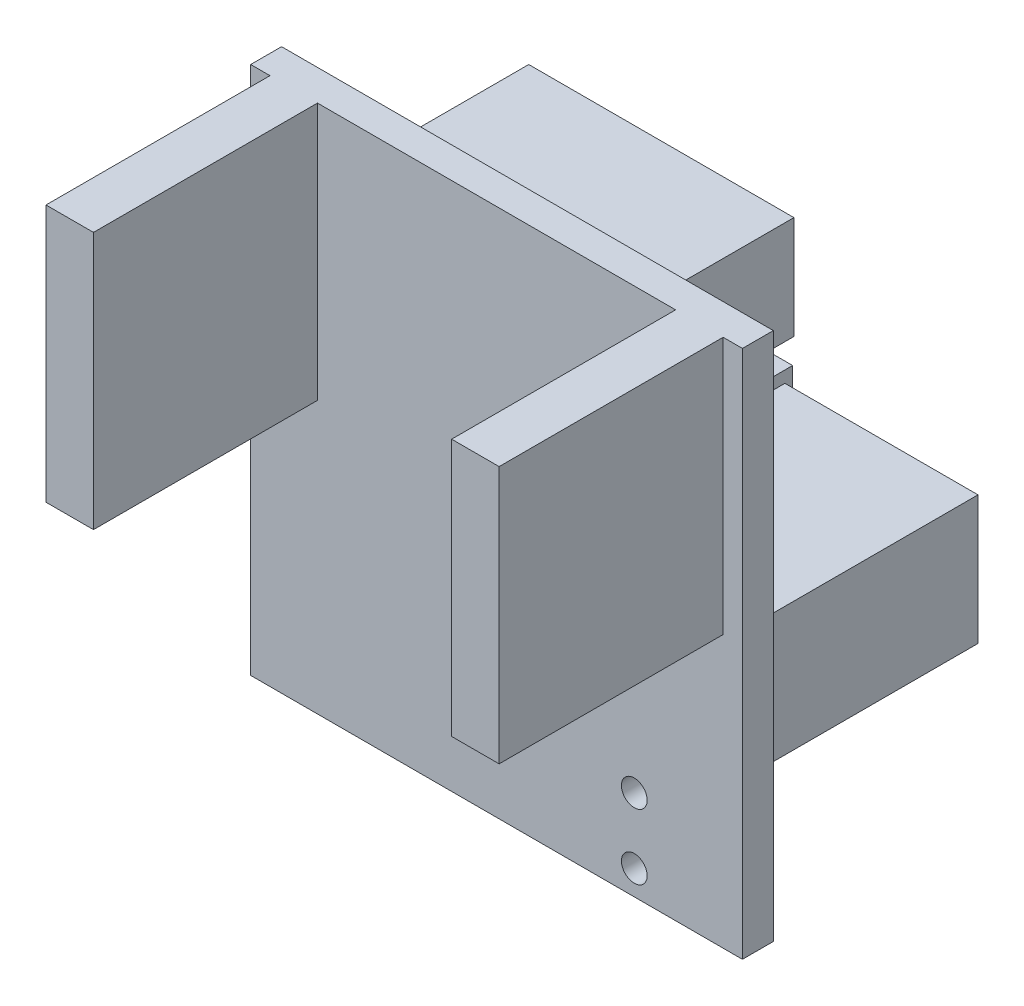
ISO-10303-21;
HEADER;
FILE_DESCRIPTION(('STEP AP214'),'2;1');
FILE_NAME('part.step','',(''),(''),'','','');
FILE_SCHEMA(('AUTOMOTIVE_DESIGN { 1 0 10303 214 1 1 1 1 }'));
ENDSEC;
DATA;
#1=APPLICATION_CONTEXT('core data for automotive mechanical design processes');
#2=APPLICATION_PROTOCOL_DEFINITION('international standard','automotive_design',2000,#1);
#3=PRODUCT_CONTEXT('',#1,'mechanical');
#4=PRODUCT('Part','Part','',(#3));
#5=PRODUCT_RELATED_PRODUCT_CATEGORY('part','',(#4));
#6=PRODUCT_DEFINITION_FORMATION('','',#4);
#7=PRODUCT_DEFINITION_CONTEXT('part definition',#1,'design');
#8=PRODUCT_DEFINITION('design','',#6,#7);
#9=PRODUCT_DEFINITION_SHAPE('','',#8);
#10=(LENGTH_UNIT() NAMED_UNIT(*) SI_UNIT(.MILLI.,.METRE.));
#11=(NAMED_UNIT(*) PLANE_ANGLE_UNIT() SI_UNIT($,.RADIAN.));
#12=(NAMED_UNIT(*) SI_UNIT($,.STERADIAN.) SOLID_ANGLE_UNIT());
#13=UNCERTAINTY_MEASURE_WITH_UNIT(LENGTH_MEASURE(1.E-05),#10,'distance_accuracy_value','');
#14=(GEOMETRIC_REPRESENTATION_CONTEXT(3) GLOBAL_UNCERTAINTY_ASSIGNED_CONTEXT((#13)) GLOBAL_UNIT_ASSIGNED_CONTEXT((#10,
#11,#12)) REPRESENTATION_CONTEXT('',''));
#15=CARTESIAN_POINT('',(0.,0.,0.));
#16=DIRECTION('',(0.,0.,1.));
#17=DIRECTION('',(1.,0.,0.));
#18=AXIS2_PLACEMENT_3D('',#15,#16,#17);
#19=CARTESIAN_POINT('',(0.,0.,0.));
#20=DIRECTION('',(0.,0.,1.));
#21=DIRECTION('',(1.,0.,0.));
#22=AXIS2_PLACEMENT_3D('',#19,#20,#21);
#23=PLANE('',#22);
#24=CARTESIAN_POINT('',(5.35,-6.775,0.));
#25=DIRECTION('',(0.,0.,-1.));
#26=DIRECTION('',(-1.,0.,0.));
#27=AXIS2_PLACEMENT_3D('',#24,#25,#26);
#28=CIRCLE('',#27,0.500000000000001);
#29=CARTESIAN_POINT('',(4.85,-6.775,0.));
#30=VERTEX_POINT('',#29);
#31=EDGE_CURVE('E384',#30,#30,#28,.T.);
#32=ORIENTED_EDGE('',*,*,#31,.F.);
#33=EDGE_LOOP('',(#32));
#34=FACE_BOUND('',#33,.T.);
#35=CARTESIAN_POINT('',(5.35,-9.315,0.));
#36=DIRECTION('',(0.,0.,-1.));
#37=DIRECTION('',(-1.,0.,0.));
#38=AXIS2_PLACEMENT_3D('',#35,#36,#37);
#39=CIRCLE('',#38,0.500000000000001);
#40=CARTESIAN_POINT('',(4.85,-9.315,0.));
#41=VERTEX_POINT('',#40);
#42=EDGE_CURVE('E389',#41,#41,#39,.T.);
#43=ORIENTED_EDGE('',*,*,#42,.F.);
#44=EDGE_LOOP('',(#43));
#45=FACE_BOUND('',#44,.T.);
#46=DIRECTION('',(0.,1.,0.));
#47=VECTOR('',#46,1.);
#48=CARTESIAN_POINT('',(-8.7,-1.525,0.));
#49=LINE('',#48,#47);
#50=CARTESIAN_POINT('',(-8.7,-9.075,0.));
#51=VERTEX_POINT('',#50);
#52=CARTESIAN_POINT('',(-8.7,-1.525,0.));
#53=VERTEX_POINT('',#52);
#54=EDGE_CURVE('E223',#51,#53,#49,.T.);
#55=ORIENTED_EDGE('',*,*,#54,.F.);
#56=DIRECTION('',(-1.,0.,0.));
#57=VECTOR('',#56,1.);
#58=CARTESIAN_POINT('',(-8.7,-9.075,0.));
#59=LINE('',#58,#57);
#60=CARTESIAN_POINT('',(-0.700000000000004,-9.075,0.));
#61=VERTEX_POINT('',#60);
#62=EDGE_CURVE('E236',#61,#51,#59,.T.);
#63=ORIENTED_EDGE('',*,*,#62,.F.);
#64=DIRECTION('',(0.,-1.,0.));
#65=VECTOR('',#64,1.);
#66=CARTESIAN_POINT('',(-0.700000000000003,-1.525,0.));
#67=LINE('',#66,#65);
#68=CARTESIAN_POINT('',(-0.700000000000003,-1.525,0.));
#69=VERTEX_POINT('',#68);
#70=EDGE_CURVE('E245',#69,#61,#67,.T.);
#71=ORIENTED_EDGE('',*,*,#70,.F.);
#72=DIRECTION('',(1.,0.,0.));
#73=VECTOR('',#72,1.);
#74=CARTESIAN_POINT('',(-8.7,-1.525,0.));
#75=LINE('',#74,#73);
#76=EDGE_CURVE('E226',#53,#69,#75,.T.);
#77=ORIENTED_EDGE('',*,*,#76,.F.);
#78=EDGE_LOOP('',(#55,#63,#71,#77));
#79=FACE_BOUND('',#78,.T.);
#80=DIRECTION('',(0.,1.,0.));
#81=VECTOR('',#80,1.);
#82=CARTESIAN_POINT('',(9.55,10.275,0.));
#83=LINE('',#82,#81);
#84=CARTESIAN_POINT('',(9.55,-10.275,0.));
#85=VERTEX_POINT('',#84);
#86=CARTESIAN_POINT('',(9.55,10.275,0.));
#87=VERTEX_POINT('',#86);
#88=EDGE_CURVE('E355',#85,#87,#83,.T.);
#89=ORIENTED_EDGE('',*,*,#88,.F.);
#90=DIRECTION('',(1.,0.,0.));
#91=VECTOR('',#90,1.);
#92=CARTESIAN_POINT('',(-9.55,-10.275,0.));
#93=LINE('',#92,#91);
#94=CARTESIAN_POINT('',(-9.55,-10.275,0.));
#95=VERTEX_POINT('',#94);
#96=EDGE_CURVE('E360',#95,#85,#93,.T.);
#97=ORIENTED_EDGE('',*,*,#96,.F.);
#98=DIRECTION('',(0.,-1.,0.));
#99=VECTOR('',#98,1.);
#100=CARTESIAN_POINT('',(-9.55,10.275,0.));
#101=LINE('',#100,#99);
#102=CARTESIAN_POINT('',(-9.55,10.275,0.));
#103=VERTEX_POINT('',#102);
#104=EDGE_CURVE('E373',#103,#95,#101,.T.);
#105=ORIENTED_EDGE('',*,*,#104,.F.);
#106=DIRECTION('',(-1.,0.,0.));
#107=VECTOR('',#106,1.);
#108=CARTESIAN_POINT('',(-9.55,10.275,0.));
#109=LINE('',#108,#107);
#110=EDGE_CURVE('E371',#87,#103,#109,.T.);
#111=ORIENTED_EDGE('',*,*,#110,.F.);
#112=EDGE_LOOP('',(#89,#97,#105,#111));
#113=FACE_BOUND('',#112,.T.);
#114=DIRECTION('',(0.,1.,0.));
#115=VECTOR('',#114,1.);
#116=CARTESIAN_POINT('',(1.3,0.0250000000000009,0.));
#117=LINE('',#116,#115);
#118=CARTESIAN_POINT('',(1.3,-4.975,0.));
#119=VERTEX_POINT('',#118);
#120=CARTESIAN_POINT('',(1.3,0.0250000000000009,0.));
#121=VERTEX_POINT('',#120);
#122=EDGE_CURVE('E261',#119,#121,#117,.T.);
#123=ORIENTED_EDGE('',*,*,#122,.F.);
#124=DIRECTION('',(-1.,0.,0.));
#125=VECTOR('',#124,1.);
#126=CARTESIAN_POINT('',(1.3,-4.975,0.));
#127=LINE('',#126,#125);
#128=CARTESIAN_POINT('',(8.8,-4.975,0.));
#129=VERTEX_POINT('',#128);
#130=EDGE_CURVE('E266',#129,#119,#127,.T.);
#131=ORIENTED_EDGE('',*,*,#130,.F.);
#132=DIRECTION('',(0.,-1.,0.));
#133=VECTOR('',#132,1.);
#134=CARTESIAN_POINT('',(8.8,0.0249999999999998,0.));
#135=LINE('',#134,#133);
#136=CARTESIAN_POINT('',(8.8,0.0249999999999998,0.));
#137=VERTEX_POINT('',#136);
#138=EDGE_CURVE('E278',#137,#129,#135,.T.);
#139=ORIENTED_EDGE('',*,*,#138,.F.);
#140=DIRECTION('',(1.,0.,0.));
#141=VECTOR('',#140,1.);
#142=CARTESIAN_POINT('',(1.3,0.0250000000000009,0.));
#143=LINE('',#142,#141);
#144=EDGE_CURVE('E275',#121,#137,#143,.T.);
#145=ORIENTED_EDGE('',*,*,#144,.F.);
#146=EDGE_LOOP('',(#123,#131,#139,#145));
#147=FACE_BOUND('',#146,.T.);
#148=DIRECTION('',(0.,1.,0.));
#149=VECTOR('',#148,1.);
#150=CARTESIAN_POINT('',(-4.45,9.975,0.));
#151=LINE('',#150,#149);
#152=CARTESIAN_POINT('',(-4.45,5.975,0.));
#153=VERTEX_POINT('',#152);
#154=CARTESIAN_POINT('',(-4.45,9.975,0.));
#155=VERTEX_POINT('',#154);
#156=EDGE_CURVE('E222',#153,#155,#151,.T.);
#157=ORIENTED_EDGE('',*,*,#156,.F.);
#158=DIRECTION('',(-1.,0.,0.));
#159=VECTOR('',#158,1.);
#160=CARTESIAN_POINT('',(-4.45,5.975,0.));
#161=LINE('',#160,#159);
#162=CARTESIAN_POINT('',(5.85,5.975,0.));
#163=VERTEX_POINT('',#162);
#164=EDGE_CURVE('E219',#163,#153,#161,.T.);
#165=ORIENTED_EDGE('',*,*,#164,.F.);
#166=DIRECTION('',(0.,-1.,0.));
#167=VECTOR('',#166,1.);
#168=CARTESIAN_POINT('',(5.85,9.975,0.));
#169=LINE('',#168,#167);
#170=CARTESIAN_POINT('',(5.85,9.975,0.));
#171=VERTEX_POINT('',#170);
#172=EDGE_CURVE('E61',#171,#163,#169,.T.);
#173=ORIENTED_EDGE('',*,*,#172,.F.);
#174=DIRECTION('',(1.,0.,0.));
#175=VECTOR('',#174,1.);
#176=CARTESIAN_POINT('',(-4.45,9.975,0.));
#177=LINE('',#176,#175);
#178=EDGE_CURVE('E56',#155,#171,#177,.T.);
#179=ORIENTED_EDGE('',*,*,#178,.F.);
#180=EDGE_LOOP('',(#157,#165,#173,#179));
#181=FACE_BOUND('',#180,.T.);
#182=ADVANCED_FACE('F39',(#34,#45,#79,#113,#147,#181),#23,.F.);
#183=CARTESIAN_POINT('',(9.55,10.275,1.2));
#184=DIRECTION('',(-1.,0.,0.));
#185=DIRECTION('',(0.,-1.,0.));
#186=AXIS2_PLACEMENT_3D('',#183,#184,#185);
#187=PLANE('',#186);
#188=ORIENTED_EDGE('',*,*,#88,.T.);
#189=DIRECTION('',(0.,0.,-1.));
#190=VECTOR('',#189,1.);
#191=CARTESIAN_POINT('',(9.55,10.275,1.2));
#192=LINE('',#191,#190);
#193=CARTESIAN_POINT('',(9.55,10.275,1.2));
#194=VERTEX_POINT('',#193);
#195=EDGE_CURVE('E11',#194,#87,#192,.T.);
#196=ORIENTED_EDGE('',*,*,#195,.F.);
#197=DIRECTION('',(0.,1.,0.));
#198=VECTOR('',#197,1.);
#199=CARTESIAN_POINT('',(9.55,10.275,1.2));
#200=LINE('',#199,#198);
#201=CARTESIAN_POINT('',(9.55,-10.275,1.2));
#202=VERTEX_POINT('',#201);
#203=EDGE_CURVE('E356',#202,#194,#200,.T.);
#204=ORIENTED_EDGE('',*,*,#203,.F.);
#205=DIRECTION('',(0.,0.,-1.));
#206=VECTOR('',#205,1.);
#207=CARTESIAN_POINT('',(9.55,-10.275,1.2));
#208=LINE('',#207,#206);
#209=EDGE_CURVE('E368',#202,#85,#208,.T.);
#210=ORIENTED_EDGE('',*,*,#209,.T.);
#211=EDGE_LOOP('',(#188,#196,#204,#210));
#212=FACE_BOUND('',#211,.T.);
#213=ADVANCED_FACE('F41',(#212),#187,.F.);
#214=CARTESIAN_POINT('',(-9.55,10.275,1.2));
#215=DIRECTION('',(0.,-1.,0.));
#216=DIRECTION('',(0.,0.,-1.));
#217=AXIS2_PLACEMENT_3D('',#214,#215,#216);
#218=PLANE('',#217);
#219=ORIENTED_EDGE('',*,*,#110,.T.);
#220=DIRECTION('',(0.,0.,-1.));
#221=VECTOR('',#220,1.);
#222=CARTESIAN_POINT('',(-9.55,10.275,1.2));
#223=LINE('',#222,#221);
#224=CARTESIAN_POINT('',(-9.55,10.275,1.2));
#225=VERTEX_POINT('',#224);
#226=EDGE_CURVE('E48',#225,#103,#223,.T.);
#227=ORIENTED_EDGE('',*,*,#226,.F.);
#228=DIRECTION('',(-1.,0.,0.));
#229=VECTOR('',#228,1.);
#230=CARTESIAN_POINT('',(-9.55,10.275,1.2));
#231=LINE('',#230,#229);
#232=CARTESIAN_POINT('',(-8.8,10.275,1.2));
#233=VERTEX_POINT('',#232);
#234=EDGE_CURVE('E359',#233,#225,#231,.T.);
#235=ORIENTED_EDGE('',*,*,#234,.F.);
#236=DIRECTION('',(0.,0.,-1.));
#237=VECTOR('',#236,1.);
#238=CARTESIAN_POINT('',(-8.8,10.275,9.9));
#239=LINE('',#238,#237);
#240=CARTESIAN_POINT('',(-8.8,10.275,9.9));
#241=VERTEX_POINT('',#240);
#242=EDGE_CURVE('E308',#241,#233,#239,.T.);
#243=ORIENTED_EDGE('',*,*,#242,.F.);
#244=DIRECTION('',(1.,0.,0.));
#245=VECTOR('',#244,1.);
#246=CARTESIAN_POINT('',(-8.8,10.275,9.9));
#247=LINE('',#246,#245);
#248=CARTESIAN_POINT('',(-6.95562416090774,10.275,9.9));
#249=VERTEX_POINT('',#248);
#250=EDGE_CURVE('E305',#241,#249,#247,.T.);
#251=ORIENTED_EDGE('',*,*,#250,.T.);
#252=DIRECTION('',(0.,0.,-1.));
#253=VECTOR('',#252,1.);
#254=CARTESIAN_POINT('',(-6.95562416090774,10.275,9.9));
#255=LINE('',#254,#253);
#256=CARTESIAN_POINT('',(-6.95562416090774,10.275,1.2));
#257=VERTEX_POINT('',#256);
#258=EDGE_CURVE('E316',#249,#257,#255,.T.);
#259=ORIENTED_EDGE('',*,*,#258,.T.);
#260=CARTESIAN_POINT('',(6.95562416090775,10.275,1.2));
#261=VERTEX_POINT('',#260);
#262=EDGE_CURVE('E364',#261,#257,#231,.T.);
#263=ORIENTED_EDGE('',*,*,#262,.F.);
#264=DIRECTION('',(0.,0.,-1.));
#265=VECTOR('',#264,1.);
#266=CARTESIAN_POINT('',(6.95562416090774,10.275,9.9));
#267=LINE('',#266,#265);
#268=CARTESIAN_POINT('',(6.95562416090774,10.275,9.9));
#269=VERTEX_POINT('',#268);
#270=EDGE_CURVE('E349',#269,#261,#267,.T.);
#271=ORIENTED_EDGE('',*,*,#270,.F.);
#272=DIRECTION('',(-1.,0.,0.));
#273=VECTOR('',#272,1.);
#274=CARTESIAN_POINT('',(8.8,10.275,9.9));
#275=LINE('',#274,#273);
#276=CARTESIAN_POINT('',(8.8,10.275,9.9));
#277=VERTEX_POINT('',#276);
#278=EDGE_CURVE('E329',#277,#269,#275,.T.);
#279=ORIENTED_EDGE('',*,*,#278,.F.);
#280=DIRECTION('',(0.,0.,-1.));
#281=VECTOR('',#280,1.);
#282=CARTESIAN_POINT('',(8.8,10.275,9.9));
#283=LINE('',#282,#281);
#284=CARTESIAN_POINT('',(8.8,10.275,1.2));
#285=VERTEX_POINT('',#284);
#286=EDGE_CURVE('E352',#277,#285,#283,.T.);
#287=ORIENTED_EDGE('',*,*,#286,.T.);
#288=EDGE_CURVE('E361',#194,#285,#231,.T.);
#289=ORIENTED_EDGE('',*,*,#288,.F.);
#290=ORIENTED_EDGE('',*,*,#195,.T.);
#291=EDGE_LOOP('',(#219,#227,#235,#243,#251,#259,#263,#271,#279,#287,#289,#290));
#292=FACE_BOUND('',#291,.T.);
#293=ADVANCED_FACE('F426',(#292),#218,.F.);
#294=CARTESIAN_POINT('',(-9.55,10.275,1.2));
#295=DIRECTION('',(1.,0.,0.));
#296=DIRECTION('',(0.,1.,0.));
#297=AXIS2_PLACEMENT_3D('',#294,#295,#296);
#298=PLANE('',#297);
#299=ORIENTED_EDGE('',*,*,#104,.T.);
#300=DIRECTION('',(0.,0.,-1.));
#301=VECTOR('',#300,1.);
#302=CARTESIAN_POINT('',(-9.55,-10.275,1.2));
#303=LINE('',#302,#301);
#304=CARTESIAN_POINT('',(-9.55,-10.275,1.2));
#305=VERTEX_POINT('',#304);
#306=EDGE_CURVE('E378',#305,#95,#303,.T.);
#307=ORIENTED_EDGE('',*,*,#306,.F.);
#308=DIRECTION('',(0.,-1.,0.));
#309=VECTOR('',#308,1.);
#310=CARTESIAN_POINT('',(-9.55,10.275,1.2));
#311=LINE('',#310,#309);
#312=EDGE_CURVE('E363',#225,#305,#311,.T.);
#313=ORIENTED_EDGE('',*,*,#312,.F.);
#314=ORIENTED_EDGE('',*,*,#226,.T.);
#315=EDGE_LOOP('',(#299,#307,#313,#314));
#316=FACE_BOUND('',#315,.T.);
#317=ADVANCED_FACE('F436',(#316),#298,.F.);
#318=CARTESIAN_POINT('',(-9.55,-10.275,1.2));
#319=DIRECTION('',(0.,1.,0.));
#320=DIRECTION('',(0.,0.,1.));
#321=AXIS2_PLACEMENT_3D('',#318,#319,#320);
#322=PLANE('',#321);
#323=ORIENTED_EDGE('',*,*,#96,.T.);
#324=ORIENTED_EDGE('',*,*,#209,.F.);
#325=DIRECTION('',(1.,0.,0.));
#326=VECTOR('',#325,1.);
#327=CARTESIAN_POINT('',(-9.55,-10.275,1.2));
#328=LINE('',#327,#326);
#329=EDGE_CURVE('E366',#305,#202,#328,.T.);
#330=ORIENTED_EDGE('',*,*,#329,.F.);
#331=ORIENTED_EDGE('',*,*,#306,.T.);
#332=EDGE_LOOP('',(#323,#324,#330,#331));
#333=FACE_BOUND('',#332,.T.);
#334=ADVANCED_FACE('F433',(#333),#322,.F.);
#335=CARTESIAN_POINT('',(0.,0.,1.2));
#336=DIRECTION('',(0.,0.,1.));
#337=DIRECTION('',(1.,0.,0.));
#338=AXIS2_PLACEMENT_3D('',#335,#336,#337);
#339=PLANE('',#338);
#340=CARTESIAN_POINT('',(5.35,-6.775,1.2));
#341=DIRECTION('',(0.,0.,1.));
#342=DIRECTION('',(1.,0.,0.));
#343=AXIS2_PLACEMENT_3D('',#340,#341,#342);
#344=CIRCLE('',#343,0.500000000000001);
#345=CARTESIAN_POINT('',(5.85,-6.775,1.2));
#346=VERTEX_POINT('',#345);
#347=EDGE_CURVE('E43',#346,#346,#344,.T.);
#348=ORIENTED_EDGE('',*,*,#347,.F.);
#349=EDGE_LOOP('',(#348));
#350=FACE_BOUND('',#349,.T.);
#351=CARTESIAN_POINT('',(5.35,-9.315,1.2));
#352=DIRECTION('',(0.,0.,1.));
#353=DIRECTION('',(1.,0.,0.));
#354=AXIS2_PLACEMENT_3D('',#351,#352,#353);
#355=CIRCLE('',#354,0.500000000000001);
#356=CARTESIAN_POINT('',(5.85,-9.315,1.2));
#357=VERTEX_POINT('',#356);
#358=EDGE_CURVE('E382',#357,#357,#355,.T.);
#359=ORIENTED_EDGE('',*,*,#358,.F.);
#360=EDGE_LOOP('',(#359));
#361=FACE_BOUND('',#360,.T.);
#362=DIRECTION('',(0.,1.,0.));
#363=VECTOR('',#362,1.);
#364=CARTESIAN_POINT('',(-8.8,10.275,1.2));
#365=LINE('',#364,#363);
#366=CARTESIAN_POINT('',(-8.8,0.275000000000003,1.2));
#367=VERTEX_POINT('',#366);
#368=EDGE_CURVE('E294',#367,#233,#365,.T.);
#369=ORIENTED_EDGE('',*,*,#368,.T.);
#370=ORIENTED_EDGE('',*,*,#234,.T.);
#371=ORIENTED_EDGE('',*,*,#312,.T.);
#372=ORIENTED_EDGE('',*,*,#329,.T.);
#373=ORIENTED_EDGE('',*,*,#203,.T.);
#374=ORIENTED_EDGE('',*,*,#288,.T.);
#375=DIRECTION('',(0.,1.,0.));
#376=VECTOR('',#375,1.);
#377=CARTESIAN_POINT('',(8.8,10.275,1.2));
#378=LINE('',#377,#376);
#379=CARTESIAN_POINT('',(8.8,0.275000000000003,1.2));
#380=VERTEX_POINT('',#379);
#381=EDGE_CURVE('E325',#380,#285,#378,.T.);
#382=ORIENTED_EDGE('',*,*,#381,.F.);
#383=DIRECTION('',(1.,0.,0.));
#384=VECTOR('',#383,1.);
#385=CARTESIAN_POINT('',(8.8,0.275000000000003,1.2));
#386=LINE('',#385,#384);
#387=CARTESIAN_POINT('',(6.95562416090775,0.275000000000002,1.2));
#388=VERTEX_POINT('',#387);
#389=EDGE_CURVE('E330',#388,#380,#386,.T.);
#390=ORIENTED_EDGE('',*,*,#389,.F.);
#391=DIRECTION('',(0.,-1.,0.));
#392=VECTOR('',#391,1.);
#393=CARTESIAN_POINT('',(6.95562416090774,10.275,1.2));
#394=LINE('',#393,#392);
#395=EDGE_CURVE('E339',#261,#388,#394,.T.);
#396=ORIENTED_EDGE('',*,*,#395,.F.);
#397=ORIENTED_EDGE('',*,*,#262,.T.);
#398=DIRECTION('',(0.,-1.,0.));
#399=VECTOR('',#398,1.);
#400=CARTESIAN_POINT('',(-6.95562416090774,10.275,1.2));
#401=LINE('',#400,#399);
#402=CARTESIAN_POINT('',(-6.95562416090775,0.275000000000002,1.2));
#403=VERTEX_POINT('',#402);
#404=EDGE_CURVE('E299',#257,#403,#401,.T.);
#405=ORIENTED_EDGE('',*,*,#404,.T.);
#406=DIRECTION('',(-1.,0.,0.));
#407=VECTOR('',#406,1.);
#408=CARTESIAN_POINT('',(-8.8,0.275000000000003,1.2));
#409=LINE('',#408,#407);
#410=EDGE_CURVE('E311',#403,#367,#409,.T.);
#411=ORIENTED_EDGE('',*,*,#410,.T.);
#412=EDGE_LOOP('',(#369,#370,#371,#372,#373,#374,#382,#390,#396,#397,#405,#411));
#413=FACE_BOUND('',#412,.T.);
#414=ADVANCED_FACE('F431',(#350,#361,#413),#339,.T.);
#415=CARTESIAN_POINT('',(8.8,10.275,9.9));
#416=DIRECTION('',(-1.,0.,0.));
#417=DIRECTION('',(0.,-1.,0.));
#418=AXIS2_PLACEMENT_3D('',#415,#416,#417);
#419=PLANE('',#418);
#420=ORIENTED_EDGE('',*,*,#381,.T.);
#421=ORIENTED_EDGE('',*,*,#286,.F.);
#422=DIRECTION('',(0.,1.,0.));
#423=VECTOR('',#422,1.);
#424=CARTESIAN_POINT('',(8.8,10.275,9.9));
#425=LINE('',#424,#423);
#426=CARTESIAN_POINT('',(8.8,0.275000000000003,9.9));
#427=VERTEX_POINT('',#426);
#428=EDGE_CURVE('E326',#427,#277,#425,.T.);
#429=ORIENTED_EDGE('',*,*,#428,.F.);
#430=DIRECTION('',(0.,0.,-1.));
#431=VECTOR('',#430,1.);
#432=CARTESIAN_POINT('',(8.8,0.275000000000003,9.9));
#433=LINE('',#432,#431);
#434=EDGE_CURVE('E336',#427,#380,#433,.T.);
#435=ORIENTED_EDGE('',*,*,#434,.T.);
#436=EDGE_LOOP('',(#420,#421,#429,#435));
#437=FACE_BOUND('',#436,.T.);
#438=ADVANCED_FACE('F501',(#437),#419,.F.);
#439=CARTESIAN_POINT('',(6.95562416090774,10.275,9.9));
#440=DIRECTION('',(1.,0.,0.));
#441=DIRECTION('',(0.,1.,0.));
#442=AXIS2_PLACEMENT_3D('',#439,#440,#441);
#443=PLANE('',#442);
#444=ORIENTED_EDGE('',*,*,#395,.T.);
#445=DIRECTION('',(0.,0.,-1.));
#446=VECTOR('',#445,1.);
#447=CARTESIAN_POINT('',(6.95562416090775,0.275000000000002,9.9));
#448=LINE('',#447,#446);
#449=CARTESIAN_POINT('',(6.95562416090775,0.275000000000002,9.9));
#450=VERTEX_POINT('',#449);
#451=EDGE_CURVE('E346',#450,#388,#448,.T.);
#452=ORIENTED_EDGE('',*,*,#451,.F.);
#453=DIRECTION('',(0.,-1.,0.));
#454=VECTOR('',#453,1.);
#455=CARTESIAN_POINT('',(6.95562416090774,10.275,9.9));
#456=LINE('',#455,#454);
#457=EDGE_CURVE('E332',#269,#450,#456,.T.);
#458=ORIENTED_EDGE('',*,*,#457,.F.);
#459=ORIENTED_EDGE('',*,*,#270,.T.);
#460=EDGE_LOOP('',(#444,#452,#458,#459));
#461=FACE_BOUND('',#460,.T.);
#462=ADVANCED_FACE('F498',(#461),#443,.F.);
#463=CARTESIAN_POINT('',(8.8,0.275000000000003,9.9));
#464=DIRECTION('',(0.,1.,0.));
#465=DIRECTION('',(-1.,0.,0.));
#466=AXIS2_PLACEMENT_3D('',#463,#464,#465);
#467=PLANE('',#466);
#468=ORIENTED_EDGE('',*,*,#389,.T.);
#469=ORIENTED_EDGE('',*,*,#434,.F.);
#470=DIRECTION('',(1.,0.,0.));
#471=VECTOR('',#470,1.);
#472=CARTESIAN_POINT('',(8.8,0.275000000000003,9.9));
#473=LINE('',#472,#471);
#474=EDGE_CURVE('E334',#450,#427,#473,.T.);
#475=ORIENTED_EDGE('',*,*,#474,.F.);
#476=ORIENTED_EDGE('',*,*,#451,.T.);
#477=EDGE_LOOP('',(#468,#469,#475,#476));
#478=FACE_BOUND('',#477,.T.);
#479=ADVANCED_FACE('F494',(#478),#467,.F.);
#480=CARTESIAN_POINT('',(0.,0.,9.9));
#481=DIRECTION('',(0.,0.,-1.));
#482=DIRECTION('',(-1.,0.,0.));
#483=AXIS2_PLACEMENT_3D('',#480,#481,#482);
#484=PLANE('',#483);
#485=ORIENTED_EDGE('',*,*,#428,.T.);
#486=ORIENTED_EDGE('',*,*,#278,.T.);
#487=ORIENTED_EDGE('',*,*,#457,.T.);
#488=ORIENTED_EDGE('',*,*,#474,.T.);
#489=EDGE_LOOP('',(#485,#486,#487,#488));
#490=FACE_BOUND('',#489,.T.);
#491=ADVANCED_FACE('F492',(#490),#484,.F.);
#492=CARTESIAN_POINT('',(-8.8,10.275,9.9));
#493=DIRECTION('',(-1.,0.,0.));
#494=DIRECTION('',(0.,-1.,0.));
#495=AXIS2_PLACEMENT_3D('',#492,#493,#494);
#496=PLANE('',#495);
#497=ORIENTED_EDGE('',*,*,#368,.F.);
#498=DIRECTION('',(0.,0.,-1.));
#499=VECTOR('',#498,1.);
#500=CARTESIAN_POINT('',(-8.8,0.275000000000003,9.9));
#501=LINE('',#500,#499);
#502=CARTESIAN_POINT('',(-8.8,0.275000000000003,9.9));
#503=VERTEX_POINT('',#502);
#504=EDGE_CURVE('E322',#503,#367,#501,.T.);
#505=ORIENTED_EDGE('',*,*,#504,.F.);
#506=DIRECTION('',(0.,1.,0.));
#507=VECTOR('',#506,1.);
#508=CARTESIAN_POINT('',(-8.8,10.275,9.9));
#509=LINE('',#508,#507);
#510=EDGE_CURVE('E295',#503,#241,#509,.T.);
#511=ORIENTED_EDGE('',*,*,#510,.T.);
#512=ORIENTED_EDGE('',*,*,#242,.T.);
#513=EDGE_LOOP('',(#497,#505,#511,#512));
#514=FACE_BOUND('',#513,.T.);
#515=ADVANCED_FACE('F473',(#514),#496,.T.);
#516=CARTESIAN_POINT('',(-8.8,0.275000000000003,9.9));
#517=DIRECTION('',(0.,-1.,0.));
#518=DIRECTION('',(1.,0.,0.));
#519=AXIS2_PLACEMENT_3D('',#516,#517,#518);
#520=PLANE('',#519);
#521=ORIENTED_EDGE('',*,*,#410,.F.);
#522=DIRECTION('',(0.,0.,-1.));
#523=VECTOR('',#522,1.);
#524=CARTESIAN_POINT('',(-6.95562416090775,0.275000000000002,9.9));
#525=LINE('',#524,#523);
#526=CARTESIAN_POINT('',(-6.95562416090775,0.275000000000002,9.9));
#527=VERTEX_POINT('',#526);
#528=EDGE_CURVE('E319',#527,#403,#525,.T.);
#529=ORIENTED_EDGE('',*,*,#528,.F.);
#530=DIRECTION('',(-1.,0.,0.));
#531=VECTOR('',#530,1.);
#532=CARTESIAN_POINT('',(-8.8,0.275000000000003,9.9));
#533=LINE('',#532,#531);
#534=EDGE_CURVE('E298',#527,#503,#533,.T.);
#535=ORIENTED_EDGE('',*,*,#534,.T.);
#536=ORIENTED_EDGE('',*,*,#504,.T.);
#537=EDGE_LOOP('',(#521,#529,#535,#536));
#538=FACE_BOUND('',#537,.T.);
#539=ADVANCED_FACE('F470',(#538),#520,.T.);
#540=CARTESIAN_POINT('',(-6.95562416090774,10.275,9.9));
#541=DIRECTION('',(1.,0.,0.));
#542=DIRECTION('',(0.,1.,0.));
#543=AXIS2_PLACEMENT_3D('',#540,#541,#542);
#544=PLANE('',#543);
#545=ORIENTED_EDGE('',*,*,#404,.F.);
#546=ORIENTED_EDGE('',*,*,#258,.F.);
#547=DIRECTION('',(0.,-1.,0.));
#548=VECTOR('',#547,1.);
#549=CARTESIAN_POINT('',(-6.95562416090774,10.275,9.9));
#550=LINE('',#549,#548);
#551=EDGE_CURVE('E302',#249,#527,#550,.T.);
#552=ORIENTED_EDGE('',*,*,#551,.T.);
#553=ORIENTED_EDGE('',*,*,#528,.T.);
#554=EDGE_LOOP('',(#545,#546,#552,#553));
#555=FACE_BOUND('',#554,.T.);
#556=ADVANCED_FACE('F466',(#555),#544,.T.);
#557=CARTESIAN_POINT('',(0.,0.,9.9));
#558=DIRECTION('',(0.,0.,-1.));
#559=DIRECTION('',(1.,0.,0.));
#560=AXIS2_PLACEMENT_3D('',#557,#558,#559);
#561=PLANE('',#560);
#562=ORIENTED_EDGE('',*,*,#510,.F.);
#563=ORIENTED_EDGE('',*,*,#534,.F.);
#564=ORIENTED_EDGE('',*,*,#551,.F.);
#565=ORIENTED_EDGE('',*,*,#250,.F.);
#566=EDGE_LOOP('',(#562,#563,#564,#565));
#567=FACE_BOUND('',#566,.T.);
#568=ADVANCED_FACE('F475',(#567),#561,.F.);
#569=CARTESIAN_POINT('',(1.3,0.0250000000000009,-8.7));
#570=DIRECTION('',(1.,0.,0.));
#571=DIRECTION('',(0.,1.,0.));
#572=AXIS2_PLACEMENT_3D('',#569,#570,#571);
#573=PLANE('',#572);
#574=ORIENTED_EDGE('',*,*,#122,.T.);
#575=DIRECTION('',(0.,0.,1.));
#576=VECTOR('',#575,1.);
#577=CARTESIAN_POINT('',(1.3,0.0250000000000009,-8.7));
#578=LINE('',#577,#576);
#579=CARTESIAN_POINT('',(1.3,0.0250000000000009,-8.7));
#580=VERTEX_POINT('',#579);
#581=EDGE_CURVE('E291',#580,#121,#578,.T.);
#582=ORIENTED_EDGE('',*,*,#581,.F.);
#583=DIRECTION('',(0.,1.,0.));
#584=VECTOR('',#583,1.);
#585=CARTESIAN_POINT('',(1.3,0.0250000000000009,-8.7));
#586=LINE('',#585,#584);
#587=CARTESIAN_POINT('',(1.3,-4.975,-8.7));
#588=VERTEX_POINT('',#587);
#589=EDGE_CURVE('E262',#588,#580,#586,.T.);
#590=ORIENTED_EDGE('',*,*,#589,.F.);
#591=DIRECTION('',(0.,0.,1.));
#592=VECTOR('',#591,1.);
#593=CARTESIAN_POINT('',(1.3,-4.975,-8.7));
#594=LINE('',#593,#592);
#595=EDGE_CURVE('E272',#588,#119,#594,.T.);
#596=ORIENTED_EDGE('',*,*,#595,.T.);
#597=EDGE_LOOP('',(#574,#582,#590,#596));
#598=FACE_BOUND('',#597,.T.);
#599=ADVANCED_FACE('F477',(#598),#573,.F.);
#600=CARTESIAN_POINT('',(1.3,0.0250000000000009,-8.7));
#601=DIRECTION('',(0.,-1.,0.));
#602=DIRECTION('',(1.,0.,0.));
#603=AXIS2_PLACEMENT_3D('',#600,#601,#602);
#604=PLANE('',#603);
#605=ORIENTED_EDGE('',*,*,#144,.T.);
#606=DIRECTION('',(0.,0.,1.));
#607=VECTOR('',#606,1.);
#608=CARTESIAN_POINT('',(8.8,0.0249999999999998,-8.7));
#609=LINE('',#608,#607);
#610=CARTESIAN_POINT('',(8.8,0.0249999999999998,-8.7));
#611=VERTEX_POINT('',#610);
#612=EDGE_CURVE('E288',#611,#137,#609,.T.);
#613=ORIENTED_EDGE('',*,*,#612,.F.);
#614=DIRECTION('',(1.,0.,0.));
#615=VECTOR('',#614,1.);
#616=CARTESIAN_POINT('',(1.3,0.0250000000000009,-8.7));
#617=LINE('',#616,#615);
#618=EDGE_CURVE('E265',#580,#611,#617,.T.);
#619=ORIENTED_EDGE('',*,*,#618,.F.);
#620=ORIENTED_EDGE('',*,*,#581,.T.);
#621=EDGE_LOOP('',(#605,#613,#619,#620));
#622=FACE_BOUND('',#621,.T.);
#623=ADVANCED_FACE('F483',(#622),#604,.F.);
#624=CARTESIAN_POINT('',(8.8,0.0249999999999998,-8.7));
#625=DIRECTION('',(-1.,0.,0.));
#626=DIRECTION('',(0.,0.,1.));
#627=AXIS2_PLACEMENT_3D('',#624,#625,#626);
#628=PLANE('',#627);
#629=ORIENTED_EDGE('',*,*,#138,.T.);
#630=DIRECTION('',(0.,0.,1.));
#631=VECTOR('',#630,1.);
#632=CARTESIAN_POINT('',(8.8,-4.975,-8.7));
#633=LINE('',#632,#631);
#634=CARTESIAN_POINT('',(8.8,-4.975,-8.7));
#635=VERTEX_POINT('',#634);
#636=EDGE_CURVE('E285',#635,#129,#633,.T.);
#637=ORIENTED_EDGE('',*,*,#636,.F.);
#638=DIRECTION('',(0.,-1.,0.));
#639=VECTOR('',#638,1.);
#640=CARTESIAN_POINT('',(8.8,0.0249999999999998,-8.7));
#641=LINE('',#640,#639);
#642=EDGE_CURVE('E268',#611,#635,#641,.T.);
#643=ORIENTED_EDGE('',*,*,#642,.F.);
#644=ORIENTED_EDGE('',*,*,#612,.T.);
#645=EDGE_LOOP('',(#629,#637,#643,#644));
#646=FACE_BOUND('',#645,.T.);
#647=ADVANCED_FACE('F629',(#646),#628,.F.);
#648=CARTESIAN_POINT('',(1.3,-4.975,-8.7));
#649=DIRECTION('',(0.,1.,0.));
#650=DIRECTION('',(-1.,0.,0.));
#651=AXIS2_PLACEMENT_3D('',#648,#649,#650);
#652=PLANE('',#651);
#653=ORIENTED_EDGE('',*,*,#130,.T.);
#654=ORIENTED_EDGE('',*,*,#595,.F.);
#655=DIRECTION('',(-1.,0.,0.));
#656=VECTOR('',#655,1.);
#657=CARTESIAN_POINT('',(1.3,-4.975,-8.7));
#658=LINE('',#657,#656);
#659=EDGE_CURVE('E270',#635,#588,#658,.T.);
#660=ORIENTED_EDGE('',*,*,#659,.F.);
#661=ORIENTED_EDGE('',*,*,#636,.T.);
#662=EDGE_LOOP('',(#653,#654,#660,#661));
#663=FACE_BOUND('',#662,.T.);
#664=ADVANCED_FACE('F619',(#663),#652,.F.);
#665=CARTESIAN_POINT('',(0.,0.,-8.7));
#666=DIRECTION('',(0.,0.,1.));
#667=DIRECTION('',(1.,0.,0.));
#668=AXIS2_PLACEMENT_3D('',#665,#666,#667);
#669=PLANE('',#668);
#670=ORIENTED_EDGE('',*,*,#589,.T.);
#671=ORIENTED_EDGE('',*,*,#618,.T.);
#672=ORIENTED_EDGE('',*,*,#642,.T.);
#673=ORIENTED_EDGE('',*,*,#659,.T.);
#674=EDGE_LOOP('',(#670,#671,#672,#673));
#675=FACE_BOUND('',#674,.T.);
#676=ADVANCED_FACE('F609',(#675),#669,.F.);
#677=CARTESIAN_POINT('',(-8.7,-1.525,-11.));
#678=DIRECTION('',(1.,0.,0.));
#679=DIRECTION('',(0.,1.,0.));
#680=AXIS2_PLACEMENT_3D('',#677,#678,#679);
#681=PLANE('',#680);
#682=ORIENTED_EDGE('',*,*,#54,.T.);
#683=DIRECTION('',(0.,0.,1.));
#684=VECTOR('',#683,1.);
#685=CARTESIAN_POINT('',(-8.7,-1.525,-11.));
#686=LINE('',#685,#684);
#687=CARTESIAN_POINT('',(-8.7,-1.525,-11.));
#688=VERTEX_POINT('',#687);
#689=EDGE_CURVE('E258',#688,#53,#686,.T.);
#690=ORIENTED_EDGE('',*,*,#689,.F.);
#691=DIRECTION('',(0.,1.,0.));
#692=VECTOR('',#691,1.);
#693=CARTESIAN_POINT('',(-8.7,-1.525,-11.));
#694=LINE('',#693,#692);
#695=CARTESIAN_POINT('',(-8.7,-9.075,-11.));
#696=VERTEX_POINT('',#695);
#697=EDGE_CURVE('E232',#696,#688,#694,.T.);
#698=ORIENTED_EDGE('',*,*,#697,.F.);
#699=DIRECTION('',(0.,0.,1.));
#700=VECTOR('',#699,1.);
#701=CARTESIAN_POINT('',(-8.7,-9.075,-11.));
#702=LINE('',#701,#700);
#703=EDGE_CURVE('E241',#696,#51,#702,.T.);
#704=ORIENTED_EDGE('',*,*,#703,.T.);
#705=EDGE_LOOP('',(#682,#690,#698,#704));
#706=FACE_BOUND('',#705,.T.);
#707=ADVANCED_FACE('F599',(#706),#681,.F.);
#708=CARTESIAN_POINT('',(-8.7,-1.525,-11.));
#709=DIRECTION('',(0.,-1.,0.));
#710=DIRECTION('',(1.,0.,0.));
#711=AXIS2_PLACEMENT_3D('',#708,#709,#710);
#712=PLANE('',#711);
#713=ORIENTED_EDGE('',*,*,#76,.T.);
#714=DIRECTION('',(0.,0.,1.));
#715=VECTOR('',#714,1.);
#716=CARTESIAN_POINT('',(-0.700000000000003,-1.525,-11.));
#717=LINE('',#716,#715);
#718=CARTESIAN_POINT('',(-0.700000000000003,-1.525,-11.));
#719=VERTEX_POINT('',#718);
#720=EDGE_CURVE('E255',#719,#69,#717,.T.);
#721=ORIENTED_EDGE('',*,*,#720,.F.);
#722=DIRECTION('',(1.,0.,0.));
#723=VECTOR('',#722,1.);
#724=CARTESIAN_POINT('',(-8.7,-1.525,-11.));
#725=LINE('',#724,#723);
#726=EDGE_CURVE('E235',#688,#719,#725,.T.);
#727=ORIENTED_EDGE('',*,*,#726,.F.);
#728=ORIENTED_EDGE('',*,*,#689,.T.);
#729=EDGE_LOOP('',(#713,#721,#727,#728));
#730=FACE_BOUND('',#729,.T.);
#731=ADVANCED_FACE('F589',(#730),#712,.F.);
#732=CARTESIAN_POINT('',(-0.700000000000003,-1.525,-11.));
#733=DIRECTION('',(-1.,0.,0.));
#734=DIRECTION('',(0.,-1.,0.));
#735=AXIS2_PLACEMENT_3D('',#732,#733,#734);
#736=PLANE('',#735);
#737=ORIENTED_EDGE('',*,*,#70,.T.);
#738=DIRECTION('',(0.,0.,1.));
#739=VECTOR('',#738,1.);
#740=CARTESIAN_POINT('',(-0.700000000000004,-9.075,-11.));
#741=LINE('',#740,#739);
#742=CARTESIAN_POINT('',(-0.700000000000004,-9.075,-11.));
#743=VERTEX_POINT('',#742);
#744=EDGE_CURVE('E252',#743,#61,#741,.T.);
#745=ORIENTED_EDGE('',*,*,#744,.F.);
#746=DIRECTION('',(0.,-1.,0.));
#747=VECTOR('',#746,1.);
#748=CARTESIAN_POINT('',(-0.700000000000003,-1.525,-11.));
#749=LINE('',#748,#747);
#750=EDGE_CURVE('E238',#719,#743,#749,.T.);
#751=ORIENTED_EDGE('',*,*,#750,.F.);
#752=ORIENTED_EDGE('',*,*,#720,.T.);
#753=EDGE_LOOP('',(#737,#745,#751,#752));
#754=FACE_BOUND('',#753,.T.);
#755=ADVANCED_FACE('F579',(#754),#736,.F.);
#756=CARTESIAN_POINT('',(-8.7,-9.075,-11.));
#757=DIRECTION('',(0.,1.,0.));
#758=DIRECTION('',(-1.,0.,0.));
#759=AXIS2_PLACEMENT_3D('',#756,#757,#758);
#760=PLANE('',#759);
#761=ORIENTED_EDGE('',*,*,#62,.T.);
#762=ORIENTED_EDGE('',*,*,#703,.F.);
#763=DIRECTION('',(-1.,0.,0.));
#764=VECTOR('',#763,1.);
#765=CARTESIAN_POINT('',(-8.7,-9.075,-11.));
#766=LINE('',#765,#764);
#767=EDGE_CURVE('E240',#743,#696,#766,.T.);
#768=ORIENTED_EDGE('',*,*,#767,.F.);
#769=ORIENTED_EDGE('',*,*,#744,.T.);
#770=EDGE_LOOP('',(#761,#762,#768,#769));
#771=FACE_BOUND('',#770,.T.);
#772=ADVANCED_FACE('F569',(#771),#760,.F.);
#773=CARTESIAN_POINT('',(0.,0.,-11.));
#774=DIRECTION('',(0.,0.,1.));
#775=DIRECTION('',(1.,0.,0.));
#776=AXIS2_PLACEMENT_3D('',#773,#774,#775);
#777=PLANE('',#776);
#778=ORIENTED_EDGE('',*,*,#697,.T.);
#779=ORIENTED_EDGE('',*,*,#726,.T.);
#780=ORIENTED_EDGE('',*,*,#750,.T.);
#781=ORIENTED_EDGE('',*,*,#767,.T.);
#782=EDGE_LOOP('',(#778,#779,#780,#781));
#783=FACE_BOUND('',#782,.T.);
#784=ADVANCED_FACE('F556',(#783),#777,.F.);
#785=CARTESIAN_POINT('',(-4.45,9.975,-4.5));
#786=DIRECTION('',(1.,0.,0.));
#787=DIRECTION('',(0.,1.,0.));
#788=AXIS2_PLACEMENT_3D('',#785,#786,#787);
#789=PLANE('',#788);
#790=ORIENTED_EDGE('',*,*,#156,.T.);
#791=DIRECTION('',(0.,0.,1.));
#792=VECTOR('',#791,1.);
#793=CARTESIAN_POINT('',(-4.45,9.975,-4.5));
#794=LINE('',#793,#792);
#795=CARTESIAN_POINT('',(-4.45,9.975,-4.5));
#796=VERTEX_POINT('',#795);
#797=EDGE_CURVE('E203',#796,#155,#794,.T.);
#798=ORIENTED_EDGE('',*,*,#797,.F.);
#799=DIRECTION('',(0.,1.,0.));
#800=VECTOR('',#799,1.);
#801=CARTESIAN_POINT('',(-4.45,9.975,-4.5));
#802=LINE('',#801,#800);
#803=CARTESIAN_POINT('',(-4.45,5.975,-4.5));
#804=VERTEX_POINT('',#803);
#805=EDGE_CURVE('E210',#804,#796,#802,.T.);
#806=ORIENTED_EDGE('',*,*,#805,.F.);
#807=DIRECTION('',(0.,0.,1.));
#808=VECTOR('',#807,1.);
#809=CARTESIAN_POINT('',(-4.45,5.975,-4.5));
#810=LINE('',#809,#808);
#811=EDGE_CURVE('E398',#804,#153,#810,.T.);
#812=ORIENTED_EDGE('',*,*,#811,.T.);
#813=EDGE_LOOP('',(#790,#798,#806,#812));
#814=FACE_BOUND('',#813,.T.);
#815=ADVANCED_FACE('F221',(#814),#789,.F.);
#816=CARTESIAN_POINT('',(-4.45,9.975,-4.5));
#817=DIRECTION('',(0.,-1.,0.));
#818=DIRECTION('',(1.,0.,0.));
#819=AXIS2_PLACEMENT_3D('',#816,#817,#818);
#820=PLANE('',#819);
#821=ORIENTED_EDGE('',*,*,#178,.T.);
#822=DIRECTION('',(0.,0.,1.));
#823=VECTOR('',#822,1.);
#824=CARTESIAN_POINT('',(5.85,9.975,-4.5));
#825=LINE('',#824,#823);
#826=CARTESIAN_POINT('',(5.85,9.975,-4.5));
#827=VERTEX_POINT('',#826);
#828=EDGE_CURVE('E206',#827,#171,#825,.T.);
#829=ORIENTED_EDGE('',*,*,#828,.F.);
#830=DIRECTION('',(1.,0.,0.));
#831=VECTOR('',#830,1.);
#832=CARTESIAN_POINT('',(-4.45,9.975,-4.5));
#833=LINE('',#832,#831);
#834=EDGE_CURVE('E199',#796,#827,#833,.T.);
#835=ORIENTED_EDGE('',*,*,#834,.F.);
#836=ORIENTED_EDGE('',*,*,#797,.T.);
#837=EDGE_LOOP('',(#821,#829,#835,#836));
#838=FACE_BOUND('',#837,.T.);
#839=ADVANCED_FACE('F201',(#838),#820,.F.);
#840=CARTESIAN_POINT('',(5.85,9.975,-4.5));
#841=DIRECTION('',(-1.,0.,0.));
#842=DIRECTION('',(0.,-1.,0.));
#843=AXIS2_PLACEMENT_3D('',#840,#841,#842);
#844=PLANE('',#843);
#845=ORIENTED_EDGE('',*,*,#172,.T.);
#846=DIRECTION('',(0.,0.,1.));
#847=VECTOR('',#846,1.);
#848=CARTESIAN_POINT('',(5.85,5.975,-4.5));
#849=LINE('',#848,#847);
#850=CARTESIAN_POINT('',(5.85,5.975,-4.5));
#851=VERTEX_POINT('',#850);
#852=EDGE_CURVE('E228',#851,#163,#849,.T.);
#853=ORIENTED_EDGE('',*,*,#852,.F.);
#854=DIRECTION('',(0.,-1.,0.));
#855=VECTOR('',#854,1.);
#856=CARTESIAN_POINT('',(5.85,9.975,-4.5));
#857=LINE('',#856,#855);
#858=EDGE_CURVE('E209',#827,#851,#857,.T.);
#859=ORIENTED_EDGE('',*,*,#858,.F.);
#860=ORIENTED_EDGE('',*,*,#828,.T.);
#861=EDGE_LOOP('',(#845,#853,#859,#860));
#862=FACE_BOUND('',#861,.T.);
#863=ADVANCED_FACE('F409',(#862),#844,.F.);
#864=CARTESIAN_POINT('',(-4.45,5.975,-4.5));
#865=DIRECTION('',(0.,1.,0.));
#866=DIRECTION('',(-1.,0.,0.));
#867=AXIS2_PLACEMENT_3D('',#864,#865,#866);
#868=PLANE('',#867);
#869=ORIENTED_EDGE('',*,*,#164,.T.);
#870=ORIENTED_EDGE('',*,*,#811,.F.);
#871=DIRECTION('',(-1.,0.,0.));
#872=VECTOR('',#871,1.);
#873=CARTESIAN_POINT('',(-4.45,5.975,-4.5));
#874=LINE('',#873,#872);
#875=EDGE_CURVE('E215',#851,#804,#874,.T.);
#876=ORIENTED_EDGE('',*,*,#875,.F.);
#877=ORIENTED_EDGE('',*,*,#852,.T.);
#878=EDGE_LOOP('',(#869,#870,#876,#877));
#879=FACE_BOUND('',#878,.T.);
#880=ADVANCED_FACE('F407',(#879),#868,.F.);
#881=CARTESIAN_POINT('',(0.,0.,-4.5));
#882=DIRECTION('',(0.,0.,1.));
#883=DIRECTION('',(1.,0.,0.));
#884=AXIS2_PLACEMENT_3D('',#881,#882,#883);
#885=PLANE('',#884);
#886=ORIENTED_EDGE('',*,*,#805,.T.);
#887=ORIENTED_EDGE('',*,*,#834,.T.);
#888=ORIENTED_EDGE('',*,*,#858,.T.);
#889=ORIENTED_EDGE('',*,*,#875,.T.);
#890=EDGE_LOOP('',(#886,#887,#888,#889));
#891=FACE_BOUND('',#890,.T.);
#892=ADVANCED_FACE('F213',(#891),#885,.F.);
#893=CARTESIAN_POINT('',(5.35,-9.315,9.9));
#894=DIRECTION('',(0.,0.,-1.));
#895=DIRECTION('',(-1.,0.,0.));
#896=AXIS2_PLACEMENT_3D('',#893,#894,#895);
#897=CYLINDRICAL_SURFACE('',#896,0.500000000000001);
#898=ORIENTED_EDGE('',*,*,#358,.T.);
#899=EDGE_LOOP('',(#898));
#900=FACE_BOUND('',#899,.T.);
#901=ORIENTED_EDGE('',*,*,#42,.T.);
#902=EDGE_LOOP('',(#901));
#903=FACE_BOUND('',#902,.T.);
#904=ADVANCED_FACE('F522',(#900,#903),#897,.F.);
#905=CARTESIAN_POINT('',(5.35,-6.775,9.9));
#906=DIRECTION('',(0.,0.,-1.));
#907=DIRECTION('',(-1.,0.,0.));
#908=AXIS2_PLACEMENT_3D('',#905,#906,#907);
#909=CYLINDRICAL_SURFACE('',#908,0.500000000000001);
#910=ORIENTED_EDGE('',*,*,#347,.T.);
#911=EDGE_LOOP('',(#910));
#912=FACE_BOUND('',#911,.T.);
#913=ORIENTED_EDGE('',*,*,#31,.T.);
#914=EDGE_LOOP('',(#913));
#915=FACE_BOUND('',#914,.T.);
#916=ADVANCED_FACE('F520',(#912,#915),#909,.F.);
#917=CLOSED_SHELL('',(#182,#213,#293,#317,#334,#414,#438,#462,#479,#491,#515,#539,#556,#568,
#599,#623,#647,#664,#676,#707,#731,#755,#772,#784,#815,#839,#863,#880,#892,#904,#916));
#918=MANIFOLD_SOLID_BREP('B2',#917);
#919=ADVANCED_BREP_SHAPE_REPRESENTATION('',(#18,#918),#14);
#920=SHAPE_DEFINITION_REPRESENTATION(#9,#919);
ENDSEC;
END-ISO-10303-21;
